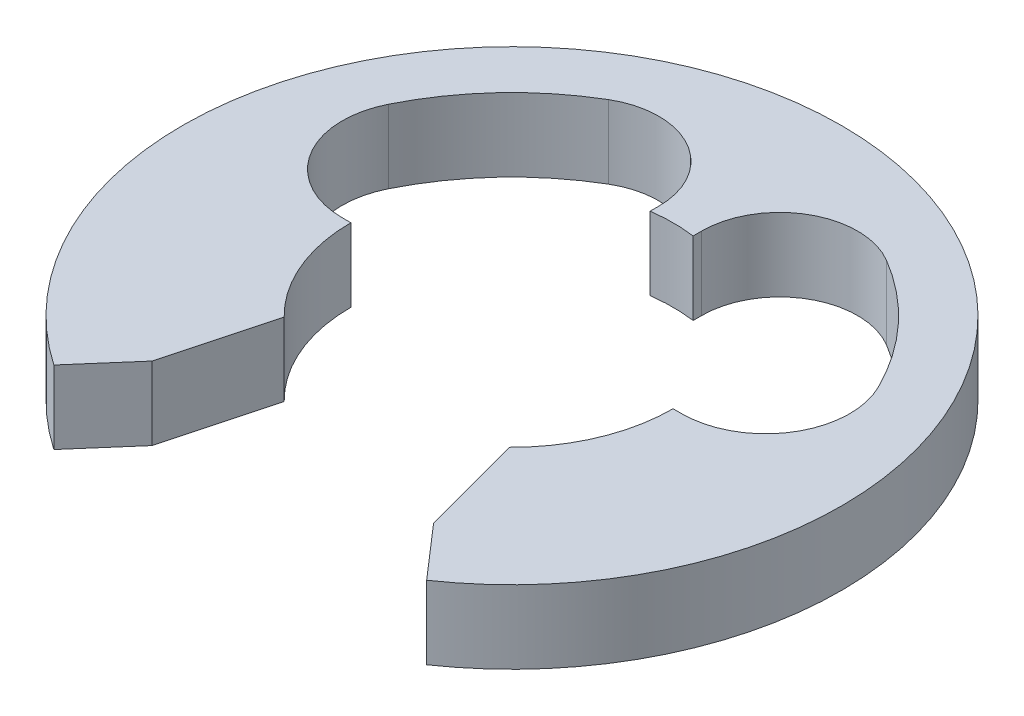
ISO-10303-21;
HEADER;
FILE_DESCRIPTION(('STEP AP214'),'2;1');
FILE_NAME('part.step','',(''),(''),'','','');
FILE_SCHEMA(('AUTOMOTIVE_DESIGN { 1 0 10303 214 1 1 1 1 }'));
ENDSEC;
DATA;
#1=APPLICATION_CONTEXT('core data for automotive mechanical design processes');
#2=APPLICATION_PROTOCOL_DEFINITION('international standard','automotive_design',2000,#1);
#3=PRODUCT_CONTEXT('',#1,'mechanical');
#4=PRODUCT('Part','Part','',(#3));
#5=PRODUCT_RELATED_PRODUCT_CATEGORY('part','',(#4));
#6=PRODUCT_DEFINITION_FORMATION('','',#4);
#7=PRODUCT_DEFINITION_CONTEXT('part definition',#1,'design');
#8=PRODUCT_DEFINITION('design','',#6,#7);
#9=PRODUCT_DEFINITION_SHAPE('','',#8);
#10=(LENGTH_UNIT() NAMED_UNIT(*) SI_UNIT(.MILLI.,.METRE.));
#11=(NAMED_UNIT(*) PLANE_ANGLE_UNIT() SI_UNIT($,.RADIAN.));
#12=(NAMED_UNIT(*) SI_UNIT($,.STERADIAN.) SOLID_ANGLE_UNIT());
#13=UNCERTAINTY_MEASURE_WITH_UNIT(LENGTH_MEASURE(1.E-05),#10,'distance_accuracy_value','');
#14=(GEOMETRIC_REPRESENTATION_CONTEXT(3) GLOBAL_UNCERTAINTY_ASSIGNED_CONTEXT((#13)) GLOBAL_UNIT_ASSIGNED_CONTEXT((#10,
#11,#12)) REPRESENTATION_CONTEXT('',''));
#15=CARTESIAN_POINT('',(0.,0.,0.));
#16=DIRECTION('',(0.,0.,1.));
#17=DIRECTION('',(1.,0.,0.));
#18=AXIS2_PLACEMENT_3D('',#15,#16,#17);
#19=CARTESIAN_POINT('',(0.,-0.5,0.));
#20=DIRECTION('',(0.,1.,0.));
#21=DIRECTION('',(0.,0.,1.));
#22=AXIS2_PLACEMENT_3D('',#19,#20,#21);
#23=CYLINDRICAL_SURFACE('',#22,2.25);
#24=CARTESIAN_POINT('',(0.,0.,0.));
#25=DIRECTION('',(0.,1.,0.));
#26=DIRECTION('',(0.,0.,1.));
#27=AXIS2_PLACEMENT_3D('',#24,#25,#26);
#28=CIRCLE('',#27,2.25);
#29=CARTESIAN_POINT('',(1.27276637738441,0.,1.85541524964084));
#30=VERTEX_POINT('',#29);
#31=CARTESIAN_POINT('',(-1.27276637738441,0.,1.85541524964084));
#32=VERTEX_POINT('',#31);
#33=EDGE_CURVE('E153',#30,#32,#28,.T.);
#34=ORIENTED_EDGE('',*,*,#33,.F.);
#35=DIRECTION('',(0.,1.,0.));
#36=VECTOR('',#35,1.);
#37=CARTESIAN_POINT('',(1.27276637738441,-0.5,1.85541524964084));
#38=LINE('',#37,#36);
#39=CARTESIAN_POINT('',(1.27276637738441,-0.5,1.85541524964084));
#40=VERTEX_POINT('',#39);
#41=EDGE_CURVE('E11',#40,#30,#38,.T.);
#42=ORIENTED_EDGE('',*,*,#41,.F.);
#43=CARTESIAN_POINT('',(0.,-0.5,0.));
#44=DIRECTION('',(0.,1.,0.));
#45=DIRECTION('',(0.,0.,1.));
#46=AXIS2_PLACEMENT_3D('',#43,#44,#45);
#47=CIRCLE('',#46,2.25);
#48=CARTESIAN_POINT('',(-1.27276637738441,-0.5,1.85541524964084));
#49=VERTEX_POINT('',#48);
#50=EDGE_CURVE('E155',#40,#49,#47,.T.);
#51=ORIENTED_EDGE('',*,*,#50,.T.);
#52=DIRECTION('',(0.,1.,0.));
#53=VECTOR('',#52,1.);
#54=CARTESIAN_POINT('',(-1.27276637738441,-0.5,1.85541524964084));
#55=LINE('',#54,#53);
#56=EDGE_CURVE('E32',#49,#32,#55,.T.);
#57=ORIENTED_EDGE('',*,*,#56,.T.);
#58=EDGE_LOOP('',(#34,#42,#51,#57));
#59=FACE_BOUND('',#58,.T.);
#60=ADVANCED_FACE('F29',(#59),#23,.T.);
#61=CARTESIAN_POINT('',(0.960376463688527,-0.5,1.4960517621906));
#62=DIRECTION('',(-0.754709580222772,0.,0.656059028990507));
#63=DIRECTION('',(0.656059028990507,0.,0.754709580222772));
#64=AXIS2_PLACEMENT_3D('',#61,#62,#63);
#65=PLANE('',#64);
#66=DIRECTION('',(0.656059028990507,0.,0.754709580222772));
#67=VECTOR('',#66,1.);
#68=CARTESIAN_POINT('',(0.960376463688527,0.,1.4960517621906));
#69=LINE('',#68,#67);
#70=CARTESIAN_POINT('',(0.960376463688527,0.,1.4960517621906));
#71=VERTEX_POINT('',#70);
#72=EDGE_CURVE('E171',#71,#30,#69,.T.);
#73=ORIENTED_EDGE('',*,*,#72,.F.);
#74=DIRECTION('',(0.,1.,0.));
#75=VECTOR('',#74,1.);
#76=CARTESIAN_POINT('',(0.960376463688527,-0.5,1.4960517621906));
#77=LINE('',#76,#75);
#78=CARTESIAN_POINT('',(0.960376463688527,-0.5,1.4960517621906));
#79=VERTEX_POINT('',#78);
#80=EDGE_CURVE('E37',#79,#71,#77,.T.);
#81=ORIENTED_EDGE('',*,*,#80,.F.);
#82=DIRECTION('',(0.656059028990507,0.,0.754709580222772));
#83=VECTOR('',#82,1.);
#84=CARTESIAN_POINT('',(0.960376463688527,-0.5,1.4960517621906));
#85=LINE('',#84,#83);
#86=EDGE_CURVE('E160',#79,#40,#85,.T.);
#87=ORIENTED_EDGE('',*,*,#86,.T.);
#88=ORIENTED_EDGE('',*,*,#41,.T.);
#89=EDGE_LOOP('',(#73,#81,#87,#88));
#90=FACE_BOUND('',#89,.T.);
#91=ADVANCED_FACE('F350',(#90),#65,.T.);
#92=CARTESIAN_POINT('',(0.77,-0.5,0.785557127139714));
#93=DIRECTION('',(-0.96592582628907,0.,0.258819045102516));
#94=DIRECTION('',(0.258819045102516,0.,0.96592582628907));
#95=AXIS2_PLACEMENT_3D('',#92,#93,#94);
#96=PLANE('',#95);
#97=DIRECTION('',(0.258819045102516,0.,0.965925826289069));
#98=VECTOR('',#97,1.);
#99=CARTESIAN_POINT('',(0.77,0.,0.785557127139714));
#100=LINE('',#99,#98);
#101=CARTESIAN_POINT('',(0.77,0.,0.785557127139714));
#102=VERTEX_POINT('',#101);
#103=EDGE_CURVE('E214',#102,#71,#100,.T.);
#104=ORIENTED_EDGE('',*,*,#103,.F.);
#105=DIRECTION('',(0.,1.,0.));
#106=VECTOR('',#105,1.);
#107=CARTESIAN_POINT('',(0.77,-0.5,0.785557127139714));
#108=LINE('',#107,#106);
#109=CARTESIAN_POINT('',(0.77,-0.5,0.785557127139714));
#110=VERTEX_POINT('',#109);
#111=EDGE_CURVE('E266',#110,#102,#108,.T.);
#112=ORIENTED_EDGE('',*,*,#111,.F.);
#113=DIRECTION('',(0.258819045102516,0.,0.965925826289069));
#114=VECTOR('',#113,1.);
#115=CARTESIAN_POINT('',(0.77,-0.5,0.785557127139714));
#116=LINE('',#115,#114);
#117=EDGE_CURVE('E262',#110,#79,#116,.T.);
#118=ORIENTED_EDGE('',*,*,#117,.T.);
#119=ORIENTED_EDGE('',*,*,#80,.T.);
#120=EDGE_LOOP('',(#104,#112,#118,#119));
#121=FACE_BOUND('',#120,.T.);
#122=ADVANCED_FACE('F355',(#121),#96,.T.);
#123=CARTESIAN_POINT('',(0.,-0.5,0.));
#124=DIRECTION('',(0.,1.,0.));
#125=DIRECTION('',(0.,0.,1.));
#126=AXIS2_PLACEMENT_3D('',#123,#124,#125);
#127=CYLINDRICAL_SURFACE('',#126,1.1);
#128=CARTESIAN_POINT('',(0.,0.,0.));
#129=DIRECTION('',(0.,-1.,0.));
#130=DIRECTION('',(0.,0.,1.));
#131=AXIS2_PLACEMENT_3D('',#128,#129,#130);
#132=CIRCLE('',#131,1.1);
#133=CARTESIAN_POINT('',(1.1,0.,0.));
#134=VERTEX_POINT('',#133);
#135=EDGE_CURVE('E211',#134,#102,#132,.T.);
#136=ORIENTED_EDGE('',*,*,#135,.F.);
#137=DIRECTION('',(0.,1.,0.));
#138=VECTOR('',#137,1.);
#139=CARTESIAN_POINT('',(1.1,-0.5,0.));
#140=LINE('',#139,#138);
#141=CARTESIAN_POINT('',(1.1,-0.5,0.));
#142=VERTEX_POINT('',#141);
#143=EDGE_CURVE('E268',#142,#134,#140,.T.);
#144=ORIENTED_EDGE('',*,*,#143,.F.);
#145=CARTESIAN_POINT('',(0.,-0.5,0.));
#146=DIRECTION('',(0.,-1.,0.));
#147=DIRECTION('',(0.,0.,1.));
#148=AXIS2_PLACEMENT_3D('',#145,#146,#147);
#149=CIRCLE('',#148,1.1);
#150=EDGE_CURVE('E259',#142,#110,#149,.T.);
#151=ORIENTED_EDGE('',*,*,#150,.T.);
#152=ORIENTED_EDGE('',*,*,#111,.T.);
#153=EDGE_LOOP('',(#136,#144,#151,#152));
#154=FACE_BOUND('',#153,.T.);
#155=ADVANCED_FACE('F347',(#154),#127,.F.);
#156=CARTESIAN_POINT('',(1.1,-0.5,0.));
#157=DIRECTION('',(0.,0.,-1.));
#158=DIRECTION('',(-1.,0.,0.));
#159=AXIS2_PLACEMENT_3D('',#156,#157,#158);
#160=PLANE('',#159);
#161=DIRECTION('',(-1.,0.,0.));
#162=VECTOR('',#161,1.);
#163=CARTESIAN_POINT('',(1.1,0.,0.));
#164=LINE('',#163,#162);
#165=CARTESIAN_POINT('',(1.15866666666667,0.,0.));
#166=VERTEX_POINT('',#165);
#167=EDGE_CURVE('E208',#166,#134,#164,.T.);
#168=ORIENTED_EDGE('',*,*,#167,.F.);
#169=DIRECTION('',(0.,1.,0.));
#170=VECTOR('',#169,1.);
#171=CARTESIAN_POINT('',(1.15866666666667,-0.5,0.));
#172=LINE('',#171,#170);
#173=CARTESIAN_POINT('',(1.15866666666667,-0.5,0.));
#174=VERTEX_POINT('',#173);
#175=EDGE_CURVE('E270',#174,#166,#172,.T.);
#176=ORIENTED_EDGE('',*,*,#175,.F.);
#177=DIRECTION('',(-1.,0.,0.));
#178=VECTOR('',#177,1.);
#179=CARTESIAN_POINT('',(1.1,-0.5,0.));
#180=LINE('',#179,#178);
#181=EDGE_CURVE('E256',#174,#142,#180,.T.);
#182=ORIENTED_EDGE('',*,*,#181,.T.);
#183=ORIENTED_EDGE('',*,*,#143,.T.);
#184=EDGE_LOOP('',(#168,#176,#182,#183));
#185=FACE_BOUND('',#184,.T.);
#186=ADVANCED_FACE('F343',(#185),#160,.T.);
#187=CARTESIAN_POINT('',(1.15866666666667,-0.5,-0.573732857142857));
#188=DIRECTION('',(0.,1.,0.));
#189=DIRECTION('',(0.,0.,1.));
#190=AXIS2_PLACEMENT_3D('',#187,#188,#189);
#191=CYLINDRICAL_SURFACE('',#190,0.573732857142857);
#192=CARTESIAN_POINT('',(1.15866666666667,0.,-0.573732857142857));
#193=DIRECTION('',(0.,-1.,0.));
#194=DIRECTION('',(0.,0.,1.));
#195=AXIS2_PLACEMENT_3D('',#192,#193,#194);
#196=CIRCLE('',#195,0.573732857142857);
#197=CARTESIAN_POINT('',(1.67281915633487,0.,-0.828323918913096));
#198=VERTEX_POINT('',#197);
#199=EDGE_CURVE('E205',#198,#166,#196,.T.);
#200=ORIENTED_EDGE('',*,*,#199,.F.);
#201=DIRECTION('',(0.,1.,0.));
#202=VECTOR('',#201,1.);
#203=CARTESIAN_POINT('',(1.67281915633487,-0.5,-0.828323918913096));
#204=LINE('',#203,#202);
#205=CARTESIAN_POINT('',(1.67281915633487,-0.5,-0.828323918913096));
#206=VERTEX_POINT('',#205);
#207=EDGE_CURVE('E272',#206,#198,#204,.T.);
#208=ORIENTED_EDGE('',*,*,#207,.F.);
#209=CARTESIAN_POINT('',(1.15866666666667,-0.5,-0.573732857142857));
#210=DIRECTION('',(0.,-1.,0.));
#211=DIRECTION('',(0.,0.,1.));
#212=AXIS2_PLACEMENT_3D('',#209,#210,#211);
#213=CIRCLE('',#212,0.573732857142857);
#214=EDGE_CURVE('E253',#206,#174,#213,.T.);
#215=ORIENTED_EDGE('',*,*,#214,.T.);
#216=ORIENTED_EDGE('',*,*,#175,.T.);
#217=EDGE_LOOP('',(#200,#208,#215,#216));
#218=FACE_BOUND('',#217,.T.);
#219=ADVANCED_FACE('F339',(#218),#191,.F.);
#220=CARTESIAN_POINT('',(0.,-0.5,0.));
#221=DIRECTION('',(0.,1.,0.));
#222=DIRECTION('',(0.,0.,1.));
#223=AXIS2_PLACEMENT_3D('',#220,#221,#222);
#224=CYLINDRICAL_SURFACE('',#223,1.86666666666667);
#225=CARTESIAN_POINT('',(0.,0.,0.));
#226=DIRECTION('',(0.,-1.,0.));
#227=DIRECTION('',(0.,0.,1.));
#228=AXIS2_PLACEMENT_3D('',#225,#226,#227);
#229=CIRCLE('',#228,1.86666666666667);
#230=CARTESIAN_POINT('',(0.949656695178051,0.,-1.60704592521432));
#231=VERTEX_POINT('',#230);
#232=EDGE_CURVE('E202',#231,#198,#229,.T.);
#233=ORIENTED_EDGE('',*,*,#232,.F.);
#234=DIRECTION('',(0.,1.,0.));
#235=VECTOR('',#234,1.);
#236=CARTESIAN_POINT('',(0.949656695178051,-0.5,-1.60704592521432));
#237=LINE('',#236,#235);
#238=CARTESIAN_POINT('',(0.949656695178051,-0.5,-1.60704592521432));
#239=VERTEX_POINT('',#238);
#240=EDGE_CURVE('E274',#239,#231,#237,.T.);
#241=ORIENTED_EDGE('',*,*,#240,.F.);
#242=CARTESIAN_POINT('',(0.,-0.5,0.));
#243=DIRECTION('',(0.,-1.,0.));
#244=DIRECTION('',(0.,0.,1.));
#245=AXIS2_PLACEMENT_3D('',#242,#243,#244);
#246=CIRCLE('',#245,1.86666666666667);
#247=EDGE_CURVE('E250',#239,#206,#246,.T.);
#248=ORIENTED_EDGE('',*,*,#247,.T.);
#249=ORIENTED_EDGE('',*,*,#207,.T.);
#250=EDGE_LOOP('',(#233,#241,#248,#249));
#251=FACE_BOUND('',#250,.T.);
#252=ADVANCED_FACE('F335',(#251),#224,.F.);
#253=CARTESIAN_POINT('',(0.678890608063124,-0.5,-1.14884504147002));
#254=DIRECTION('',(0.,1.,0.));
#255=DIRECTION('',(0.,0.,1.));
#256=AXIS2_PLACEMENT_3D('',#253,#254,#255);
#257=CYLINDRICAL_SURFACE('',#256,0.532223941396458);
#258=CARTESIAN_POINT('',(0.678890608063124,0.,-1.14884504147002));
#259=DIRECTION('',(0.,-1.,0.));
#260=DIRECTION('',(0.,0.,-1.));
#261=AXIS2_PLACEMENT_3D('',#258,#259,#260);
#262=CIRCLE('',#261,0.532223941396458);
#263=CARTESIAN_POINT('',(0.146666666666667,0.,-1.14884504147002));
#264=VERTEX_POINT('',#263);
#265=EDGE_CURVE('E199',#264,#231,#262,.T.);
#266=ORIENTED_EDGE('',*,*,#265,.F.);
#267=DIRECTION('',(0.,1.,0.));
#268=VECTOR('',#267,1.);
#269=CARTESIAN_POINT('',(0.146666666666667,-0.5,-1.14884504147002));
#270=LINE('',#269,#268);
#271=CARTESIAN_POINT('',(0.146666666666667,-0.5,-1.14884504147002));
#272=VERTEX_POINT('',#271);
#273=EDGE_CURVE('E276',#272,#264,#270,.T.);
#274=ORIENTED_EDGE('',*,*,#273,.F.);
#275=CARTESIAN_POINT('',(0.678890608063124,-0.5,-1.14884504147002));
#276=DIRECTION('',(0.,-1.,0.));
#277=DIRECTION('',(0.,0.,-1.));
#278=AXIS2_PLACEMENT_3D('',#275,#276,#277);
#279=CIRCLE('',#278,0.532223941396458);
#280=EDGE_CURVE('E247',#272,#239,#279,.T.);
#281=ORIENTED_EDGE('',*,*,#280,.T.);
#282=ORIENTED_EDGE('',*,*,#240,.T.);
#283=EDGE_LOOP('',(#266,#274,#281,#282));
#284=FACE_BOUND('',#283,.T.);
#285=ADVANCED_FACE('F331',(#284),#257,.F.);
#286=CARTESIAN_POINT('',(0.146666666666667,-0.5,-1.09017837480336));
#287=DIRECTION('',(1.,0.,0.));
#288=DIRECTION('',(0.,0.,-1.));
#289=AXIS2_PLACEMENT_3D('',#286,#287,#288);
#290=PLANE('',#289);
#291=DIRECTION('',(0.,0.,-1.));
#292=VECTOR('',#291,1.);
#293=CARTESIAN_POINT('',(0.146666666666667,0.,-1.09017837480336));
#294=LINE('',#293,#292);
#295=CARTESIAN_POINT('',(0.146666666666667,0.,-1.09017837480336));
#296=VERTEX_POINT('',#295);
#297=EDGE_CURVE('E196',#296,#264,#294,.T.);
#298=ORIENTED_EDGE('',*,*,#297,.F.);
#299=DIRECTION('',(0.,1.,0.));
#300=VECTOR('',#299,1.);
#301=CARTESIAN_POINT('',(0.146666666666667,-0.5,-1.09017837480336));
#302=LINE('',#301,#300);
#303=CARTESIAN_POINT('',(0.146666666666667,-0.5,-1.09017837480336));
#304=VERTEX_POINT('',#303);
#305=EDGE_CURVE('E278',#304,#296,#302,.T.);
#306=ORIENTED_EDGE('',*,*,#305,.F.);
#307=DIRECTION('',(0.,0.,-1.));
#308=VECTOR('',#307,1.);
#309=CARTESIAN_POINT('',(0.146666666666667,-0.5,-1.09017837480336));
#310=LINE('',#309,#308);
#311=EDGE_CURVE('E244',#304,#272,#310,.T.);
#312=ORIENTED_EDGE('',*,*,#311,.T.);
#313=ORIENTED_EDGE('',*,*,#273,.T.);
#314=EDGE_LOOP('',(#298,#306,#312,#313));
#315=FACE_BOUND('',#314,.T.);
#316=ADVANCED_FACE('F327',(#315),#290,.T.);
#317=CARTESIAN_POINT('',(0.,-0.5,0.));
#318=DIRECTION('',(0.,1.,0.));
#319=DIRECTION('',(0.,0.,1.));
#320=AXIS2_PLACEMENT_3D('',#317,#318,#319);
#321=CYLINDRICAL_SURFACE('',#320,1.1);
#322=CARTESIAN_POINT('',(0.,0.,0.));
#323=DIRECTION('',(0.,-1.,0.));
#324=DIRECTION('',(0.,0.,1.));
#325=AXIS2_PLACEMENT_3D('',#322,#323,#324);
#326=CIRCLE('',#325,1.1);
#327=CARTESIAN_POINT('',(-0.146666666666667,0.,-1.09017837480336));
#328=VERTEX_POINT('',#327);
#329=EDGE_CURVE('E193',#328,#296,#326,.T.);
#330=ORIENTED_EDGE('',*,*,#329,.F.);
#331=DIRECTION('',(0.,1.,0.));
#332=VECTOR('',#331,1.);
#333=CARTESIAN_POINT('',(-0.146666666666667,-0.5,-1.09017837480336));
#334=LINE('',#333,#332);
#335=CARTESIAN_POINT('',(-0.146666666666667,-0.5,-1.09017837480336));
#336=VERTEX_POINT('',#335);
#337=EDGE_CURVE('E280',#336,#328,#334,.T.);
#338=ORIENTED_EDGE('',*,*,#337,.F.);
#339=CARTESIAN_POINT('',(0.,-0.5,0.));
#340=DIRECTION('',(0.,-1.,0.));
#341=DIRECTION('',(0.,0.,1.));
#342=AXIS2_PLACEMENT_3D('',#339,#340,#341);
#343=CIRCLE('',#342,1.1);
#344=EDGE_CURVE('E241',#336,#304,#343,.T.);
#345=ORIENTED_EDGE('',*,*,#344,.T.);
#346=ORIENTED_EDGE('',*,*,#305,.T.);
#347=EDGE_LOOP('',(#330,#338,#345,#346));
#348=FACE_BOUND('',#347,.T.);
#349=ADVANCED_FACE('F323',(#348),#321,.F.);
#350=CARTESIAN_POINT('',(-0.146666666666667,-0.5,-1.09017837480336));
#351=DIRECTION('',(-1.,0.,0.));
#352=DIRECTION('',(0.,0.,1.));
#353=AXIS2_PLACEMENT_3D('',#350,#351,#352);
#354=PLANE('',#353);
#355=DIRECTION('',(0.,0.,1.));
#356=VECTOR('',#355,1.);
#357=CARTESIAN_POINT('',(-0.146666666666667,0.,-1.09017837480336));
#358=LINE('',#357,#356);
#359=CARTESIAN_POINT('',(-0.146666666666667,0.,-1.14884504147002));
#360=VERTEX_POINT('',#359);
#361=EDGE_CURVE('E190',#360,#328,#358,.T.);
#362=ORIENTED_EDGE('',*,*,#361,.F.);
#363=DIRECTION('',(0.,1.,0.));
#364=VECTOR('',#363,1.);
#365=CARTESIAN_POINT('',(-0.146666666666667,-0.5,-1.14884504147002));
#366=LINE('',#365,#364);
#367=CARTESIAN_POINT('',(-0.146666666666667,-0.5,-1.14884504147002));
#368=VERTEX_POINT('',#367);
#369=EDGE_CURVE('E282',#368,#360,#366,.T.);
#370=ORIENTED_EDGE('',*,*,#369,.F.);
#371=DIRECTION('',(0.,0.,1.));
#372=VECTOR('',#371,1.);
#373=CARTESIAN_POINT('',(-0.146666666666667,-0.5,-1.09017837480336));
#374=LINE('',#373,#372);
#375=EDGE_CURVE('E238',#368,#336,#374,.T.);
#376=ORIENTED_EDGE('',*,*,#375,.T.);
#377=ORIENTED_EDGE('',*,*,#337,.T.);
#378=EDGE_LOOP('',(#362,#370,#376,#377));
#379=FACE_BOUND('',#378,.T.);
#380=ADVANCED_FACE('F319',(#379),#354,.T.);
#381=CARTESIAN_POINT('',(-0.678890608063124,-0.5,-1.14884504147002));
#382=DIRECTION('',(0.,1.,0.));
#383=DIRECTION('',(0.,0.,1.));
#384=AXIS2_PLACEMENT_3D('',#381,#382,#383);
#385=CYLINDRICAL_SURFACE('',#384,0.532223941396458);
#386=CARTESIAN_POINT('',(-0.678890608063124,0.,-1.14884504147002));
#387=DIRECTION('',(0.,-1.,0.));
#388=DIRECTION('',(0.,0.,1.));
#389=AXIS2_PLACEMENT_3D('',#386,#387,#388);
#390=CIRCLE('',#389,0.532223941396458);
#391=CARTESIAN_POINT('',(-0.949656695178052,0.,-1.60704592521432));
#392=VERTEX_POINT('',#391);
#393=EDGE_CURVE('E187',#392,#360,#390,.T.);
#394=ORIENTED_EDGE('',*,*,#393,.F.);
#395=DIRECTION('',(0.,1.,0.));
#396=VECTOR('',#395,1.);
#397=CARTESIAN_POINT('',(-0.949656695178052,-0.5,-1.60704592521432));
#398=LINE('',#397,#396);
#399=CARTESIAN_POINT('',(-0.949656695178052,-0.5,-1.60704592521432));
#400=VERTEX_POINT('',#399);
#401=EDGE_CURVE('E284',#400,#392,#398,.T.);
#402=ORIENTED_EDGE('',*,*,#401,.F.);
#403=CARTESIAN_POINT('',(-0.678890608063124,-0.5,-1.14884504147002));
#404=DIRECTION('',(0.,-1.,0.));
#405=DIRECTION('',(0.,0.,1.));
#406=AXIS2_PLACEMENT_3D('',#403,#404,#405);
#407=CIRCLE('',#406,0.532223941396458);
#408=EDGE_CURVE('E235',#400,#368,#407,.T.);
#409=ORIENTED_EDGE('',*,*,#408,.T.);
#410=ORIENTED_EDGE('',*,*,#369,.T.);
#411=EDGE_LOOP('',(#394,#402,#409,#410));
#412=FACE_BOUND('',#411,.T.);
#413=ADVANCED_FACE('F315',(#412),#385,.F.);
#414=CARTESIAN_POINT('',(0.,-0.5,0.));
#415=DIRECTION('',(0.,1.,0.));
#416=DIRECTION('',(0.,0.,1.));
#417=AXIS2_PLACEMENT_3D('',#414,#415,#416);
#418=CYLINDRICAL_SURFACE('',#417,1.86666666666667);
#419=CARTESIAN_POINT('',(0.,0.,0.));
#420=DIRECTION('',(0.,-1.,0.));
#421=DIRECTION('',(0.,0.,-1.));
#422=AXIS2_PLACEMENT_3D('',#419,#420,#421);
#423=CIRCLE('',#422,1.86666666666667);
#424=CARTESIAN_POINT('',(-1.67281915633487,0.,-0.828323918913096));
#425=VERTEX_POINT('',#424);
#426=EDGE_CURVE('E184',#425,#392,#423,.T.);
#427=ORIENTED_EDGE('',*,*,#426,.F.);
#428=DIRECTION('',(0.,1.,0.));
#429=VECTOR('',#428,1.);
#430=CARTESIAN_POINT('',(-1.67281915633487,-0.5,-0.828323918913096));
#431=LINE('',#430,#429);
#432=CARTESIAN_POINT('',(-1.67281915633487,-0.5,-0.828323918913096));
#433=VERTEX_POINT('',#432);
#434=EDGE_CURVE('E286',#433,#425,#431,.T.);
#435=ORIENTED_EDGE('',*,*,#434,.F.);
#436=CARTESIAN_POINT('',(0.,-0.5,0.));
#437=DIRECTION('',(0.,-1.,0.));
#438=DIRECTION('',(0.,0.,-1.));
#439=AXIS2_PLACEMENT_3D('',#436,#437,#438);
#440=CIRCLE('',#439,1.86666666666667);
#441=EDGE_CURVE('E232',#433,#400,#440,.T.);
#442=ORIENTED_EDGE('',*,*,#441,.T.);
#443=ORIENTED_EDGE('',*,*,#401,.T.);
#444=EDGE_LOOP('',(#427,#435,#442,#443));
#445=FACE_BOUND('',#444,.T.);
#446=ADVANCED_FACE('F311',(#445),#418,.F.);
#447=CARTESIAN_POINT('',(-1.15866666666667,-0.5,-0.573732857142857));
#448=DIRECTION('',(0.,1.,0.));
#449=DIRECTION('',(0.,0.,1.));
#450=AXIS2_PLACEMENT_3D('',#447,#448,#449);
#451=CYLINDRICAL_SURFACE('',#450,0.573732857142857);
#452=CARTESIAN_POINT('',(-1.15866666666667,0.,-0.573732857142857));
#453=DIRECTION('',(0.,-1.,0.));
#454=DIRECTION('',(0.,0.,-1.));
#455=AXIS2_PLACEMENT_3D('',#452,#453,#454);
#456=CIRCLE('',#455,0.573732857142857);
#457=CARTESIAN_POINT('',(-1.15866666666667,0.,0.));
#458=VERTEX_POINT('',#457);
#459=EDGE_CURVE('E181',#458,#425,#456,.T.);
#460=ORIENTED_EDGE('',*,*,#459,.F.);
#461=DIRECTION('',(0.,1.,0.));
#462=VECTOR('',#461,1.);
#463=CARTESIAN_POINT('',(-1.15866666666667,-0.5,0.));
#464=LINE('',#463,#462);
#465=CARTESIAN_POINT('',(-1.15866666666667,-0.5,0.));
#466=VERTEX_POINT('',#465);
#467=EDGE_CURVE('E288',#466,#458,#464,.T.);
#468=ORIENTED_EDGE('',*,*,#467,.F.);
#469=CARTESIAN_POINT('',(-1.15866666666667,-0.5,-0.573732857142857));
#470=DIRECTION('',(0.,-1.,0.));
#471=DIRECTION('',(0.,0.,-1.));
#472=AXIS2_PLACEMENT_3D('',#469,#470,#471);
#473=CIRCLE('',#472,0.573732857142857);
#474=EDGE_CURVE('E229',#466,#433,#473,.T.);
#475=ORIENTED_EDGE('',*,*,#474,.T.);
#476=ORIENTED_EDGE('',*,*,#434,.T.);
#477=EDGE_LOOP('',(#460,#468,#475,#476));
#478=FACE_BOUND('',#477,.T.);
#479=ADVANCED_FACE('F307',(#478),#451,.F.);
#480=CARTESIAN_POINT('',(-1.1,-0.5,0.));
#481=DIRECTION('',(0.,0.,-1.));
#482=DIRECTION('',(-1.,0.,0.));
#483=AXIS2_PLACEMENT_3D('',#480,#481,#482);
#484=PLANE('',#483);
#485=DIRECTION('',(-1.,0.,0.));
#486=VECTOR('',#485,1.);
#487=CARTESIAN_POINT('',(-1.1,0.,0.));
#488=LINE('',#487,#486);
#489=CARTESIAN_POINT('',(-1.1,0.,0.));
#490=VERTEX_POINT('',#489);
#491=EDGE_CURVE('E178',#490,#458,#488,.T.);
#492=ORIENTED_EDGE('',*,*,#491,.F.);
#493=DIRECTION('',(0.,1.,0.));
#494=VECTOR('',#493,1.);
#495=CARTESIAN_POINT('',(-1.1,-0.5,0.));
#496=LINE('',#495,#494);
#497=CARTESIAN_POINT('',(-1.1,-0.5,0.));
#498=VERTEX_POINT('',#497);
#499=EDGE_CURVE('E290',#498,#490,#496,.T.);
#500=ORIENTED_EDGE('',*,*,#499,.F.);
#501=DIRECTION('',(-1.,0.,0.));
#502=VECTOR('',#501,1.);
#503=CARTESIAN_POINT('',(-1.1,-0.5,0.));
#504=LINE('',#503,#502);
#505=EDGE_CURVE('E226',#498,#466,#504,.T.);
#506=ORIENTED_EDGE('',*,*,#505,.T.);
#507=ORIENTED_EDGE('',*,*,#467,.T.);
#508=EDGE_LOOP('',(#492,#500,#506,#507));
#509=FACE_BOUND('',#508,.T.);
#510=ADVANCED_FACE('F303',(#509),#484,.T.);
#511=CARTESIAN_POINT('',(0.,-0.5,0.));
#512=DIRECTION('',(0.,1.,0.));
#513=DIRECTION('',(0.,0.,1.));
#514=AXIS2_PLACEMENT_3D('',#511,#512,#513);
#515=CYLINDRICAL_SURFACE('',#514,1.1);
#516=CARTESIAN_POINT('',(0.,0.,0.));
#517=DIRECTION('',(0.,-1.,0.));
#518=DIRECTION('',(0.,0.,-1.));
#519=AXIS2_PLACEMENT_3D('',#516,#517,#518);
#520=CIRCLE('',#519,1.1);
#521=CARTESIAN_POINT('',(-0.77,0.,0.785557127139714));
#522=VERTEX_POINT('',#521);
#523=EDGE_CURVE('E175',#522,#490,#520,.T.);
#524=ORIENTED_EDGE('',*,*,#523,.F.);
#525=DIRECTION('',(0.,1.,0.));
#526=VECTOR('',#525,1.);
#527=CARTESIAN_POINT('',(-0.77,-0.5,0.785557127139714));
#528=LINE('',#527,#526);
#529=CARTESIAN_POINT('',(-0.77,-0.5,0.785557127139714));
#530=VERTEX_POINT('',#529);
#531=EDGE_CURVE('E292',#530,#522,#528,.T.);
#532=ORIENTED_EDGE('',*,*,#531,.F.);
#533=CARTESIAN_POINT('',(0.,-0.5,0.));
#534=DIRECTION('',(0.,-1.,0.));
#535=DIRECTION('',(0.,0.,-1.));
#536=AXIS2_PLACEMENT_3D('',#533,#534,#535);
#537=CIRCLE('',#536,1.1);
#538=EDGE_CURVE('E223',#530,#498,#537,.T.);
#539=ORIENTED_EDGE('',*,*,#538,.T.);
#540=ORIENTED_EDGE('',*,*,#499,.T.);
#541=EDGE_LOOP('',(#524,#532,#539,#540));
#542=FACE_BOUND('',#541,.T.);
#543=ADVANCED_FACE('F299',(#542),#515,.F.);
#544=CARTESIAN_POINT('',(-0.77,-0.5,0.785557127139714));
#545=DIRECTION('',(0.96592582628907,0.,0.258819045102516));
#546=DIRECTION('',(0.258819045102516,0.,-0.96592582628907));
#547=AXIS2_PLACEMENT_3D('',#544,#545,#546);
#548=PLANE('',#547);
#549=DIRECTION('',(0.258819045102516,0.,-0.965925826289069));
#550=VECTOR('',#549,1.);
#551=CARTESIAN_POINT('',(-0.77,0.,0.785557127139714));
#552=LINE('',#551,#550);
#553=CARTESIAN_POINT('',(-0.960376463688527,0.,1.4960517621906));
#554=VERTEX_POINT('',#553);
#555=EDGE_CURVE('E167',#554,#522,#552,.T.);
#556=ORIENTED_EDGE('',*,*,#555,.F.);
#557=DIRECTION('',(0.,1.,0.));
#558=VECTOR('',#557,1.);
#559=CARTESIAN_POINT('',(-0.960376463688527,-0.5,1.4960517621906));
#560=LINE('',#559,#558);
#561=CARTESIAN_POINT('',(-0.960376463688527,-0.5,1.4960517621906));
#562=VERTEX_POINT('',#561);
#563=EDGE_CURVE('E159',#562,#554,#560,.T.);
#564=ORIENTED_EDGE('',*,*,#563,.F.);
#565=DIRECTION('',(0.258819045102516,0.,-0.965925826289069));
#566=VECTOR('',#565,1.);
#567=CARTESIAN_POINT('',(-0.77,-0.5,0.785557127139714));
#568=LINE('',#567,#566);
#569=EDGE_CURVE('E220',#562,#530,#568,.T.);
#570=ORIENTED_EDGE('',*,*,#569,.T.);
#571=ORIENTED_EDGE('',*,*,#531,.T.);
#572=EDGE_LOOP('',(#556,#564,#570,#571));
#573=FACE_BOUND('',#572,.T.);
#574=ADVANCED_FACE('F295',(#573),#548,.T.);
#575=CARTESIAN_POINT('',(-0.960376463688527,-0.5,1.4960517621906));
#576=DIRECTION('',(0.754709580222772,0.,0.656059028990507));
#577=DIRECTION('',(0.656059028990507,0.,-0.754709580222772));
#578=AXIS2_PLACEMENT_3D('',#575,#576,#577);
#579=PLANE('',#578);
#580=DIRECTION('',(0.656059028990507,0.,-0.754709580222772));
#581=VECTOR('',#580,1.);
#582=CARTESIAN_POINT('',(-0.960376463688527,0.,1.4960517621906));
#583=LINE('',#582,#581);
#584=EDGE_CURVE('E162',#32,#554,#583,.T.);
#585=ORIENTED_EDGE('',*,*,#584,.F.);
#586=ORIENTED_EDGE('',*,*,#56,.F.);
#587=DIRECTION('',(0.656059028990507,0.,-0.754709580222772));
#588=VECTOR('',#587,1.);
#589=CARTESIAN_POINT('',(-0.960376463688527,-0.5,1.4960517621906));
#590=LINE('',#589,#588);
#591=EDGE_CURVE('E218',#49,#562,#590,.T.);
#592=ORIENTED_EDGE('',*,*,#591,.T.);
#593=ORIENTED_EDGE('',*,*,#563,.T.);
#594=EDGE_LOOP('',(#585,#586,#592,#593));
#595=FACE_BOUND('',#594,.T.);
#596=ADVANCED_FACE('F163',(#595),#579,.T.);
#597=CARTESIAN_POINT('',(0.,-0.5,0.));
#598=DIRECTION('',(0.,1.,0.));
#599=DIRECTION('',(0.,0.,1.));
#600=AXIS2_PLACEMENT_3D('',#597,#598,#599);
#601=PLANE('',#600);
#602=ORIENTED_EDGE('',*,*,#50,.F.);
#603=ORIENTED_EDGE('',*,*,#86,.F.);
#604=ORIENTED_EDGE('',*,*,#117,.F.);
#605=ORIENTED_EDGE('',*,*,#150,.F.);
#606=ORIENTED_EDGE('',*,*,#181,.F.);
#607=ORIENTED_EDGE('',*,*,#214,.F.);
#608=ORIENTED_EDGE('',*,*,#247,.F.);
#609=ORIENTED_EDGE('',*,*,#280,.F.);
#610=ORIENTED_EDGE('',*,*,#311,.F.);
#611=ORIENTED_EDGE('',*,*,#344,.F.);
#612=ORIENTED_EDGE('',*,*,#375,.F.);
#613=ORIENTED_EDGE('',*,*,#408,.F.);
#614=ORIENTED_EDGE('',*,*,#441,.F.);
#615=ORIENTED_EDGE('',*,*,#474,.F.);
#616=ORIENTED_EDGE('',*,*,#505,.F.);
#617=ORIENTED_EDGE('',*,*,#538,.F.);
#618=ORIENTED_EDGE('',*,*,#569,.F.);
#619=ORIENTED_EDGE('',*,*,#591,.F.);
#620=EDGE_LOOP('',(#602,#603,#604,#605,#606,#607,#608,#609,#610,#611,#612,#613,#614,#615,#616,
#617,#618,#619));
#621=FACE_BOUND('',#620,.T.);
#622=ADVANCED_FACE('F354',(#621),#601,.F.);
#623=CARTESIAN_POINT('',(0.,0.,0.));
#624=DIRECTION('',(0.,1.,0.));
#625=DIRECTION('',(0.,0.,1.));
#626=AXIS2_PLACEMENT_3D('',#623,#624,#625);
#627=PLANE('',#626);
#628=ORIENTED_EDGE('',*,*,#33,.T.);
#629=ORIENTED_EDGE('',*,*,#584,.T.);
#630=ORIENTED_EDGE('',*,*,#555,.T.);
#631=ORIENTED_EDGE('',*,*,#523,.T.);
#632=ORIENTED_EDGE('',*,*,#491,.T.);
#633=ORIENTED_EDGE('',*,*,#459,.T.);
#634=ORIENTED_EDGE('',*,*,#426,.T.);
#635=ORIENTED_EDGE('',*,*,#393,.T.);
#636=ORIENTED_EDGE('',*,*,#361,.T.);
#637=ORIENTED_EDGE('',*,*,#329,.T.);
#638=ORIENTED_EDGE('',*,*,#297,.T.);
#639=ORIENTED_EDGE('',*,*,#265,.T.);
#640=ORIENTED_EDGE('',*,*,#232,.T.);
#641=ORIENTED_EDGE('',*,*,#199,.T.);
#642=ORIENTED_EDGE('',*,*,#167,.T.);
#643=ORIENTED_EDGE('',*,*,#135,.T.);
#644=ORIENTED_EDGE('',*,*,#103,.T.);
#645=ORIENTED_EDGE('',*,*,#72,.T.);
#646=EDGE_LOOP('',(#628,#629,#630,#631,#632,#633,#634,#635,#636,#637,#638,#639,#640,#641,#642,
#643,#644,#645));
#647=FACE_BOUND('',#646,.T.);
#648=ADVANCED_FACE('F169',(#647),#627,.T.);
#649=CLOSED_SHELL('',(#60,#91,#122,#155,#186,#219,#252,#285,#316,#349,#380,#413,#446,#479,#510,
#543,#574,#596,#622,#648));
#650=MANIFOLD_SOLID_BREP('B2',#649);
#651=ADVANCED_BREP_SHAPE_REPRESENTATION('',(#18,#650),#14);
#652=SHAPE_DEFINITION_REPRESENTATION(#9,#651);
ENDSEC;
END-ISO-10303-21;
